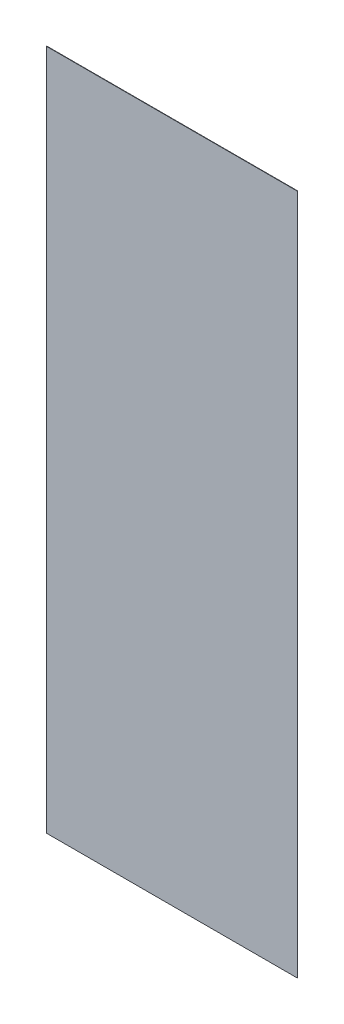
ISO-10303-21;
HEADER;
FILE_DESCRIPTION(('STEP AP214'),'2;1');
FILE_NAME('part.step','',(''),(''),'','','');
FILE_SCHEMA(('AUTOMOTIVE_DESIGN { 1 0 10303 214 1 1 1 1 }'));
ENDSEC;
DATA;
#1=APPLICATION_CONTEXT('core data for automotive mechanical design processes');
#2=APPLICATION_PROTOCOL_DEFINITION('international standard','automotive_design',2000,#1);
#3=PRODUCT_CONTEXT('',#1,'mechanical');
#4=PRODUCT('Part','Part','',(#3));
#5=PRODUCT_RELATED_PRODUCT_CATEGORY('part','',(#4));
#6=PRODUCT_DEFINITION_FORMATION('','',#4);
#7=PRODUCT_DEFINITION_CONTEXT('part definition',#1,'design');
#8=PRODUCT_DEFINITION('design','',#6,#7);
#9=PRODUCT_DEFINITION_SHAPE('','',#8);
#10=(LENGTH_UNIT() NAMED_UNIT(*) SI_UNIT(.MILLI.,.METRE.));
#11=(NAMED_UNIT(*) PLANE_ANGLE_UNIT() SI_UNIT($,.RADIAN.));
#12=(NAMED_UNIT(*) SI_UNIT($,.STERADIAN.) SOLID_ANGLE_UNIT());
#13=UNCERTAINTY_MEASURE_WITH_UNIT(LENGTH_MEASURE(1.E-05),#10,'distance_accuracy_value','');
#14=(GEOMETRIC_REPRESENTATION_CONTEXT(3) GLOBAL_UNCERTAINTY_ASSIGNED_CONTEXT((#13)) GLOBAL_UNIT_ASSIGNED_CONTEXT((#10,
#11,#12)) REPRESENTATION_CONTEXT('',''));
#15=CARTESIAN_POINT('',(0.,0.,0.));
#16=DIRECTION('',(0.,0.,1.));
#17=DIRECTION('',(1.,0.,0.));
#18=AXIS2_PLACEMENT_3D('',#15,#16,#17);
#19=CARTESIAN_POINT('',(31.5,120.,-581.));
#20=DIRECTION('',(-1.,0.,0.));
#21=DIRECTION('',(0.,0.,1.));
#22=AXIS2_PLACEMENT_3D('',#19,#20,#21);
#23=PLANE('',#22);
#24=DIRECTION('',(0.,-1.,0.));
#25=VECTOR('',#24,1.);
#26=CARTESIAN_POINT('',(31.5,120.,-580.));
#27=LINE('',#26,#25);
#28=CARTESIAN_POINT('',(31.5,1850.,-580.));
#29=VERTEX_POINT('',#28);
#30=CARTESIAN_POINT('',(31.5,120.,-580.));
#31=VERTEX_POINT('',#30);
#32=EDGE_CURVE('E103',#29,#31,#27,.T.);
#33=ORIENTED_EDGE('',*,*,#32,.F.);
#34=DIRECTION('',(0.,0.,1.));
#35=VECTOR('',#34,1.);
#36=CARTESIAN_POINT('',(31.5,1850.,-581.));
#37=LINE('',#36,#35);
#38=CARTESIAN_POINT('',(31.5,1850.,-581.));
#39=VERTEX_POINT('',#38);
#40=EDGE_CURVE('E11',#39,#29,#37,.T.);
#41=ORIENTED_EDGE('',*,*,#40,.F.);
#42=DIRECTION('',(0.,-1.,0.));
#43=VECTOR('',#42,1.);
#44=CARTESIAN_POINT('',(31.5,120.,-581.));
#45=LINE('',#44,#43);
#46=CARTESIAN_POINT('',(31.5,120.,-581.));
#47=VERTEX_POINT('',#46);
#48=EDGE_CURVE('E97',#39,#47,#45,.T.);
#49=ORIENTED_EDGE('',*,*,#48,.T.);
#50=DIRECTION('',(0.,0.,1.));
#51=VECTOR('',#50,1.);
#52=CARTESIAN_POINT('',(31.5,120.,-581.));
#53=LINE('',#52,#51);
#54=EDGE_CURVE('E42',#47,#31,#53,.T.);
#55=ORIENTED_EDGE('',*,*,#54,.T.);
#56=EDGE_LOOP('',(#33,#41,#49,#55));
#57=FACE_BOUND('',#56,.T.);
#58=ADVANCED_FACE('F39',(#57),#23,.T.);
#59=CARTESIAN_POINT('',(31.5,1850.,-581.));
#60=DIRECTION('',(0.,1.,0.));
#61=DIRECTION('',(0.,0.,1.));
#62=AXIS2_PLACEMENT_3D('',#59,#60,#61);
#63=PLANE('',#62);
#64=DIRECTION('',(-1.,0.,0.));
#65=VECTOR('',#64,1.);
#66=CARTESIAN_POINT('',(31.5,1850.,-580.));
#67=LINE('',#66,#65);
#68=CARTESIAN_POINT('',(668.5,1850.,-580.));
#69=VERTEX_POINT('',#68);
#70=EDGE_CURVE('E99',#69,#29,#67,.T.);
#71=ORIENTED_EDGE('',*,*,#70,.F.);
#72=DIRECTION('',(0.,0.,1.));
#73=VECTOR('',#72,1.);
#74=CARTESIAN_POINT('',(668.5,1850.,-581.));
#75=LINE('',#74,#73);
#76=CARTESIAN_POINT('',(668.5,1850.,-581.));
#77=VERTEX_POINT('',#76);
#78=EDGE_CURVE('E48',#77,#69,#75,.T.);
#79=ORIENTED_EDGE('',*,*,#78,.F.);
#80=DIRECTION('',(-1.,0.,0.));
#81=VECTOR('',#80,1.);
#82=CARTESIAN_POINT('',(31.5,1850.,-581.));
#83=LINE('',#82,#81);
#84=EDGE_CURVE('E94',#77,#39,#83,.T.);
#85=ORIENTED_EDGE('',*,*,#84,.T.);
#86=ORIENTED_EDGE('',*,*,#40,.T.);
#87=EDGE_LOOP('',(#71,#79,#85,#86));
#88=FACE_BOUND('',#87,.T.);
#89=ADVANCED_FACE('F113',(#88),#63,.T.);
#90=CARTESIAN_POINT('',(668.5,120.,-581.));
#91=DIRECTION('',(1.,0.,0.));
#92=DIRECTION('',(0.,0.,-1.));
#93=AXIS2_PLACEMENT_3D('',#90,#91,#92);
#94=PLANE('',#93);
#95=DIRECTION('',(0.,1.,0.));
#96=VECTOR('',#95,1.);
#97=CARTESIAN_POINT('',(668.5,120.,-580.));
#98=LINE('',#97,#96);
#99=CARTESIAN_POINT('',(668.5,120.,-580.));
#100=VERTEX_POINT('',#99);
#101=EDGE_CURVE('E89',#100,#69,#98,.T.);
#102=ORIENTED_EDGE('',*,*,#101,.F.);
#103=DIRECTION('',(0.,0.,1.));
#104=VECTOR('',#103,1.);
#105=CARTESIAN_POINT('',(668.5,120.,-581.));
#106=LINE('',#105,#104);
#107=CARTESIAN_POINT('',(668.5,120.,-581.));
#108=VERTEX_POINT('',#107);
#109=EDGE_CURVE('E84',#108,#100,#106,.T.);
#110=ORIENTED_EDGE('',*,*,#109,.F.);
#111=DIRECTION('',(0.,1.,0.));
#112=VECTOR('',#111,1.);
#113=CARTESIAN_POINT('',(668.5,120.,-581.));
#114=LINE('',#113,#112);
#115=EDGE_CURVE('E87',#108,#77,#114,.T.);
#116=ORIENTED_EDGE('',*,*,#115,.T.);
#117=ORIENTED_EDGE('',*,*,#78,.T.);
#118=EDGE_LOOP('',(#102,#110,#116,#117));
#119=FACE_BOUND('',#118,.T.);
#120=ADVANCED_FACE('F86',(#119),#94,.T.);
#121=CARTESIAN_POINT('',(31.5,120.,-581.));
#122=DIRECTION('',(0.,-1.,0.));
#123=DIRECTION('',(0.,0.,-1.));
#124=AXIS2_PLACEMENT_3D('',#121,#122,#123);
#125=PLANE('',#124);
#126=DIRECTION('',(1.,0.,0.));
#127=VECTOR('',#126,1.);
#128=CARTESIAN_POINT('',(31.5,120.,-580.));
#129=LINE('',#128,#127);
#130=EDGE_CURVE('E106',#31,#100,#129,.T.);
#131=ORIENTED_EDGE('',*,*,#130,.F.);
#132=ORIENTED_EDGE('',*,*,#54,.F.);
#133=DIRECTION('',(1.,0.,0.));
#134=VECTOR('',#133,1.);
#135=CARTESIAN_POINT('',(31.5,120.,-581.));
#136=LINE('',#135,#134);
#137=EDGE_CURVE('E93',#47,#108,#136,.T.);
#138=ORIENTED_EDGE('',*,*,#137,.T.);
#139=ORIENTED_EDGE('',*,*,#109,.T.);
#140=EDGE_LOOP('',(#131,#132,#138,#139));
#141=FACE_BOUND('',#140,.T.);
#142=ADVANCED_FACE('F96',(#141),#125,.T.);
#143=CARTESIAN_POINT('',(0.,0.,-581.));
#144=DIRECTION('',(0.,0.,-1.));
#145=DIRECTION('',(-1.,0.,0.));
#146=AXIS2_PLACEMENT_3D('',#143,#144,#145);
#147=PLANE('',#146);
#148=ORIENTED_EDGE('',*,*,#48,.F.);
#149=ORIENTED_EDGE('',*,*,#84,.F.);
#150=ORIENTED_EDGE('',*,*,#115,.F.);
#151=ORIENTED_EDGE('',*,*,#137,.F.);
#152=EDGE_LOOP('',(#148,#149,#150,#151));
#153=FACE_BOUND('',#152,.T.);
#154=ADVANCED_FACE('F92',(#153),#147,.T.);
#155=CARTESIAN_POINT('',(0.,0.,-580.));
#156=DIRECTION('',(0.,0.,-1.));
#157=DIRECTION('',(-1.,0.,0.));
#158=AXIS2_PLACEMENT_3D('',#155,#156,#157);
#159=PLANE('',#158);
#160=ORIENTED_EDGE('',*,*,#32,.T.);
#161=ORIENTED_EDGE('',*,*,#130,.T.);
#162=ORIENTED_EDGE('',*,*,#101,.T.);
#163=ORIENTED_EDGE('',*,*,#70,.T.);
#164=EDGE_LOOP('',(#160,#161,#162,#163));
#165=FACE_BOUND('',#164,.T.);
#166=ADVANCED_FACE('F112',(#165),#159,.F.);
#167=CLOSED_SHELL('',(#58,#89,#120,#142,#154,#166));
#168=MANIFOLD_SOLID_BREP('B2',#167);
#169=ADVANCED_BREP_SHAPE_REPRESENTATION('',(#18,#168),#14);
#170=SHAPE_DEFINITION_REPRESENTATION(#9,#169);
ENDSEC;
END-ISO-10303-21;
